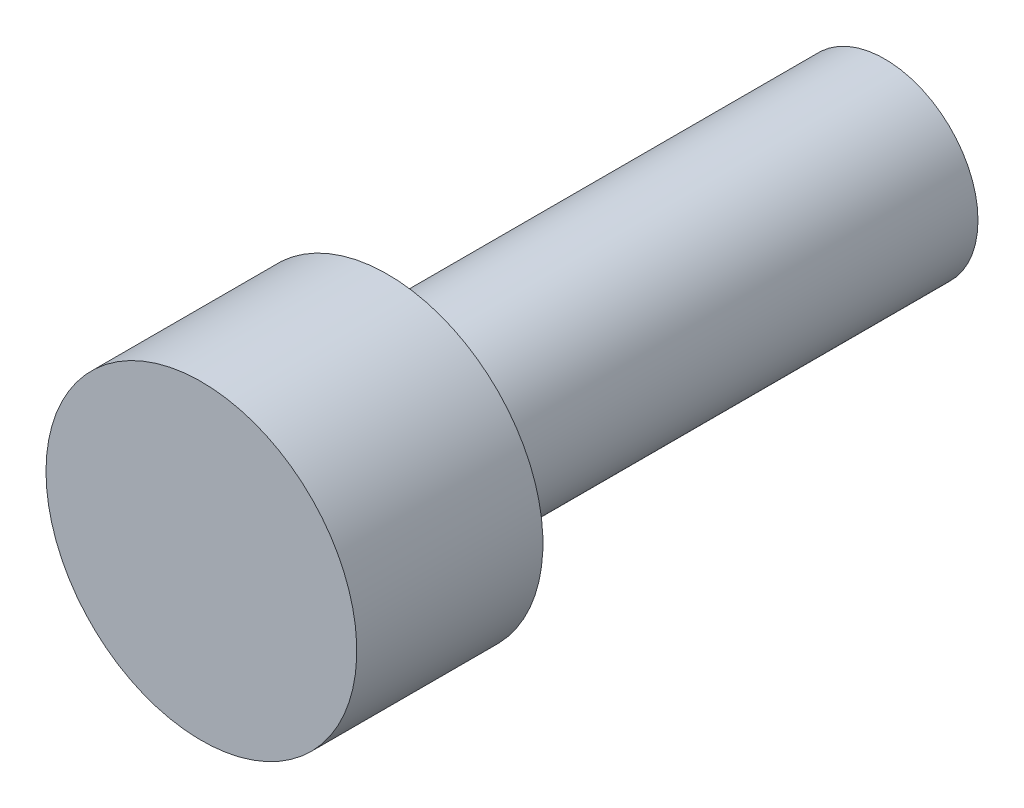
ISO-10303-21;
HEADER;
FILE_DESCRIPTION(('STEP AP214'),'2;1');
FILE_NAME('part.step','',(''),(''),'','','');
FILE_SCHEMA(('AUTOMOTIVE_DESIGN { 1 0 10303 214 1 1 1 1 }'));
ENDSEC;
DATA;
#1=APPLICATION_CONTEXT('core data for automotive mechanical design processes');
#2=APPLICATION_PROTOCOL_DEFINITION('international standard','automotive_design',2000,#1);
#3=PRODUCT_CONTEXT('',#1,'mechanical');
#4=PRODUCT('Part','Part','',(#3));
#5=PRODUCT_RELATED_PRODUCT_CATEGORY('part','',(#4));
#6=PRODUCT_DEFINITION_FORMATION('','',#4);
#7=PRODUCT_DEFINITION_CONTEXT('part definition',#1,'design');
#8=PRODUCT_DEFINITION('design','',#6,#7);
#9=PRODUCT_DEFINITION_SHAPE('','',#8);
#10=(LENGTH_UNIT() NAMED_UNIT(*) SI_UNIT(.MILLI.,.METRE.));
#11=(NAMED_UNIT(*) PLANE_ANGLE_UNIT() SI_UNIT($,.RADIAN.));
#12=(NAMED_UNIT(*) SI_UNIT($,.STERADIAN.) SOLID_ANGLE_UNIT());
#13=UNCERTAINTY_MEASURE_WITH_UNIT(LENGTH_MEASURE(1.E-05),#10,'distance_accuracy_value','');
#14=(GEOMETRIC_REPRESENTATION_CONTEXT(3) GLOBAL_UNCERTAINTY_ASSIGNED_CONTEXT((#13)) GLOBAL_UNIT_ASSIGNED_CONTEXT((#10,
#11,#12)) REPRESENTATION_CONTEXT('',''));
#15=CARTESIAN_POINT('',(0.,0.,0.));
#16=DIRECTION('',(0.,0.,1.));
#17=DIRECTION('',(1.,0.,0.));
#18=AXIS2_PLACEMENT_3D('',#15,#16,#17);
#19=CARTESIAN_POINT('',(0.,0.,-16.));
#20=DIRECTION('',(0.,0.,1.));
#21=DIRECTION('',(1.,0.,0.));
#22=AXIS2_PLACEMENT_3D('',#19,#20,#21);
#23=CYLINDRICAL_SURFACE('',#22,3.);
#24=CARTESIAN_POINT('',(0.,0.,-16.));
#25=DIRECTION('',(0.,0.,1.));
#26=DIRECTION('',(1.,0.,0.));
#27=AXIS2_PLACEMENT_3D('',#24,#25,#26);
#28=CIRCLE('',#27,3.);
#29=CARTESIAN_POINT('',(3.,0.,-16.));
#30=VERTEX_POINT('',#29);
#31=EDGE_CURVE('E10',#30,#30,#28,.T.);
#32=ORIENTED_EDGE('',*,*,#31,.T.);
#33=EDGE_LOOP('',(#32));
#34=FACE_BOUND('',#33,.T.);
#35=CARTESIAN_POINT('',(0.,0.,0.));
#36=DIRECTION('',(0.,0.,1.));
#37=DIRECTION('',(1.,0.,0.));
#38=AXIS2_PLACEMENT_3D('',#35,#36,#37);
#39=CIRCLE('',#38,3.);
#40=CARTESIAN_POINT('',(3.,0.,0.));
#41=VERTEX_POINT('',#40);
#42=EDGE_CURVE('E48',#41,#41,#39,.T.);
#43=ORIENTED_EDGE('',*,*,#42,.F.);
#44=EDGE_LOOP('',(#43));
#45=FACE_BOUND('',#44,.T.);
#46=ADVANCED_FACE('F45',(#34,#45),#23,.T.);
#47=CARTESIAN_POINT('',(0.,0.,-16.));
#48=DIRECTION('',(0.,0.,1.));
#49=DIRECTION('',(1.,0.,0.));
#50=AXIS2_PLACEMENT_3D('',#47,#48,#49);
#51=PLANE('',#50);
#52=ORIENTED_EDGE('',*,*,#31,.F.);
#53=EDGE_LOOP('',(#52));
#54=FACE_BOUND('',#53,.T.);
#55=ADVANCED_FACE('F72',(#54),#51,.F.);
#56=CARTESIAN_POINT('',(0.,0.,5.99));
#57=DIRECTION('',(0.,0.,-1.));
#58=DIRECTION('',(-1.,0.,0.));
#59=AXIS2_PLACEMENT_3D('',#56,#57,#58);
#60=CYLINDRICAL_SURFACE('',#59,5.);
#61=CARTESIAN_POINT('',(0.,0.,5.99));
#62=DIRECTION('',(0.,0.,1.));
#63=DIRECTION('',(1.,0.,0.));
#64=AXIS2_PLACEMENT_3D('',#61,#62,#63);
#65=CIRCLE('',#64,5.);
#66=CARTESIAN_POINT('',(-5.,0.,5.99));
#67=VERTEX_POINT('',#66);
#68=EDGE_CURVE('E59',#67,#67,#65,.T.);
#69=CARTESIAN_POINT('',(0.,0.,0.));
#70=DIRECTION('',(0.,0.,1.));
#71=DIRECTION('',(1.,0.,0.));
#72=AXIS2_PLACEMENT_3D('',#69,#70,#71);
#73=CIRCLE('',#72,5.);
#74=CARTESIAN_POINT('',(-5.,0.,0.));
#75=VERTEX_POINT('',#74);
#76=EDGE_CURVE('E61',#75,#75,#73,.T.);
#77=CARTESIAN_POINT('',(-5.,0.,5.99));
#78=CARTESIAN_POINT('',(-5.,0.,5.92760416666667));
#79=CARTESIAN_POINT('',(-5.,0.,5.86520833333333));
#80=CARTESIAN_POINT('',(-5.,0.,5.74041666666667));
#81=CARTESIAN_POINT('',(-5.,0.,5.67802083333333));
#82=CARTESIAN_POINT('',(-5.,0.,5.55322916666667));
#83=CARTESIAN_POINT('',(-5.,0.,5.49083333333333));
#84=CARTESIAN_POINT('',(-5.,0.,5.36604166666667));
#85=CARTESIAN_POINT('',(-5.,0.,5.30364583333333));
#86=CARTESIAN_POINT('',(-5.,0.,5.17885416666667));
#87=CARTESIAN_POINT('',(-5.,0.,5.11645833333333));
#88=CARTESIAN_POINT('',(-5.,0.,4.99166666666667));
#89=CARTESIAN_POINT('',(-5.,0.,4.92927083333333));
#90=CARTESIAN_POINT('',(-5.,0.,4.80447916666667));
#91=CARTESIAN_POINT('',(-5.,0.,4.74208333333333));
#92=CARTESIAN_POINT('',(-5.,0.,4.61729166666667));
#93=CARTESIAN_POINT('',(-5.,0.,4.55489583333333));
#94=CARTESIAN_POINT('',(-5.,0.,4.43010416666667));
#95=CARTESIAN_POINT('',(-5.,0.,4.36770833333333));
#96=CARTESIAN_POINT('',(-5.,0.,4.24291666666667));
#97=CARTESIAN_POINT('',(-5.,0.,4.18052083333333));
#98=CARTESIAN_POINT('',(-5.,0.,4.05572916666667));
#99=CARTESIAN_POINT('',(-5.,0.,3.99333333333333));
#100=CARTESIAN_POINT('',(-5.,0.,3.86854166666667));
#101=CARTESIAN_POINT('',(-5.,0.,3.80614583333333));
#102=CARTESIAN_POINT('',(-5.,0.,3.68135416666667));
#103=CARTESIAN_POINT('',(-5.,0.,3.61895833333333));
#104=CARTESIAN_POINT('',(-5.,0.,3.49416666666667));
#105=CARTESIAN_POINT('',(-5.,0.,3.43177083333333));
#106=CARTESIAN_POINT('',(-5.,0.,3.30697916666667));
#107=CARTESIAN_POINT('',(-5.,0.,3.24458333333333));
#108=CARTESIAN_POINT('',(-5.,0.,3.11979166666667));
#109=CARTESIAN_POINT('',(-5.,0.,3.05739583333333));
#110=CARTESIAN_POINT('',(-5.,0.,2.93260416666667));
#111=CARTESIAN_POINT('',(-5.,0.,2.87020833333333));
#112=CARTESIAN_POINT('',(-5.,0.,2.74541666666667));
#113=CARTESIAN_POINT('',(-5.,0.,2.68302083333333));
#114=CARTESIAN_POINT('',(-5.,0.,2.55822916666667));
#115=CARTESIAN_POINT('',(-5.,0.,2.49583333333333));
#116=CARTESIAN_POINT('',(-5.,0.,2.37104166666667));
#117=CARTESIAN_POINT('',(-5.,0.,2.30864583333333));
#118=CARTESIAN_POINT('',(-5.,0.,2.18385416666667));
#119=CARTESIAN_POINT('',(-5.,0.,2.12145833333333));
#120=CARTESIAN_POINT('',(-5.,0.,1.99666666666667));
#121=CARTESIAN_POINT('',(-5.,0.,1.93427083333333));
#122=CARTESIAN_POINT('',(-5.,0.,1.80947916666667));
#123=CARTESIAN_POINT('',(-5.,0.,1.74708333333333));
#124=CARTESIAN_POINT('',(-5.,0.,1.62229166666667));
#125=CARTESIAN_POINT('',(-5.,0.,1.55989583333333));
#126=CARTESIAN_POINT('',(-5.,0.,1.43510416666667));
#127=CARTESIAN_POINT('',(-5.,0.,1.37270833333333));
#128=CARTESIAN_POINT('',(-5.,0.,1.24791666666667));
#129=CARTESIAN_POINT('',(-5.,0.,1.18552083333333));
#130=CARTESIAN_POINT('',(-5.,0.,1.06072916666667));
#131=CARTESIAN_POINT('',(-5.,0.,0.998333333333333));
#132=CARTESIAN_POINT('',(-5.,0.,0.873541666666666));
#133=CARTESIAN_POINT('',(-5.,0.,0.811145833333333));
#134=CARTESIAN_POINT('',(-5.,0.,0.686354166666666));
#135=CARTESIAN_POINT('',(-5.,0.,0.623958333333333));
#136=CARTESIAN_POINT('',(-5.,0.,0.499166666666666));
#137=CARTESIAN_POINT('',(-5.,0.,0.436770833333332));
#138=CARTESIAN_POINT('',(-5.,0.,0.311979166666666));
#139=CARTESIAN_POINT('',(-5.,0.,0.249583333333332));
#140=CARTESIAN_POINT('',(-5.,0.,0.124791666666666));
#141=CARTESIAN_POINT('',(-5.,0.,0.0623958333333325));
#142=CARTESIAN_POINT('',(-5.,0.,0.));
#143=B_SPLINE_CURVE_WITH_KNOTS('',3,(#77,#78,#79,#80,#81,#82,#83,#84,#85,#86,#87,#88,#89,#90,
#91,#92,#93,#94,#95,#96,#97,#98,#99,#100,#101,#102,#103,#104,#105,#106,#107,#108,#109,#110,#111,
#112,#113,#114,#115,#116,#117,#118,#119,#120,#121,#122,#123,#124,#125,#126,#127,#128,#129,#130,
#131,#132,#133,#134,#135,#136,#137,#138,#139,#140,#141,#142),.UNSPECIFIED.,.F.,.F.,(4,2,2,2,2,2,
2,2,2,2,2,2,2,2,2,2,2,2,2,2,2,2,2,2,2,2,2,2,2,2,2,2,4),(0.,0.1871875,0.374375,0.5615625,
0.748749999999999,0.9359375,1.123125,1.3103125,1.4975,1.6846875,1.871875,2.0590625,2.24625,
2.4334375,2.620625,2.8078125,2.995,3.1821875,3.369375,3.5565625,3.74375,3.9309375,4.118125,
4.3053125,4.4925,4.6796875,4.866875,5.0540625,5.24125,5.4284375,5.615625,5.8028125,5.99),.UNSPECIFIED.);
#144=EDGE_CURVE('BSEAM69',#67,#75,#143,.T.);
#145=ORIENTED_EDGE('',*,*,#68,.F.);
#146=ORIENTED_EDGE('',*,*,#76,.T.);
#147=ORIENTED_EDGE('',*,*,#144,.T.);
#148=ORIENTED_EDGE('',*,*,#144,.F.);
#149=EDGE_LOOP('',(#145,#147,#146,#148));
#150=FACE_BOUND('',#149,.T.);
#151=ADVANCED_FACE('F69',(#150),#60,.T.);
#152=CARTESIAN_POINT('',(0.,0.,5.99));
#153=DIRECTION('',(0.,0.,1.));
#154=DIRECTION('',(1.,0.,0.));
#155=AXIS2_PLACEMENT_3D('',#152,#153,#154);
#156=PLANE('',#155);
#157=ORIENTED_EDGE('',*,*,#68,.T.);
#158=EDGE_LOOP('',(#157));
#159=FACE_BOUND('',#158,.T.);
#160=ADVANCED_FACE('F67',(#159),#156,.T.);
#161=CARTESIAN_POINT('',(0.,0.,0.));
#162=DIRECTION('',(0.,0.,1.));
#163=DIRECTION('',(1.,0.,0.));
#164=AXIS2_PLACEMENT_3D('',#161,#162,#163);
#165=PLANE('',#164);
#166=ORIENTED_EDGE('',*,*,#42,.T.);
#167=EDGE_LOOP('',(#166));
#168=FACE_BOUND('',#167,.T.);
#169=ORIENTED_EDGE('',*,*,#76,.F.);
#170=EDGE_LOOP('',(#169));
#171=FACE_BOUND('',#170,.T.);
#172=ADVANCED_FACE('F76',(#168,#171),#165,.F.);
#173=CLOSED_SHELL('',(#46,#55,#151,#160,#172));
#174=MANIFOLD_SOLID_BREP('B2',#173);
#175=ADVANCED_BREP_SHAPE_REPRESENTATION('',(#18,#174),#14);
#176=SHAPE_DEFINITION_REPRESENTATION(#9,#175);
ENDSEC;
END-ISO-10303-21;
